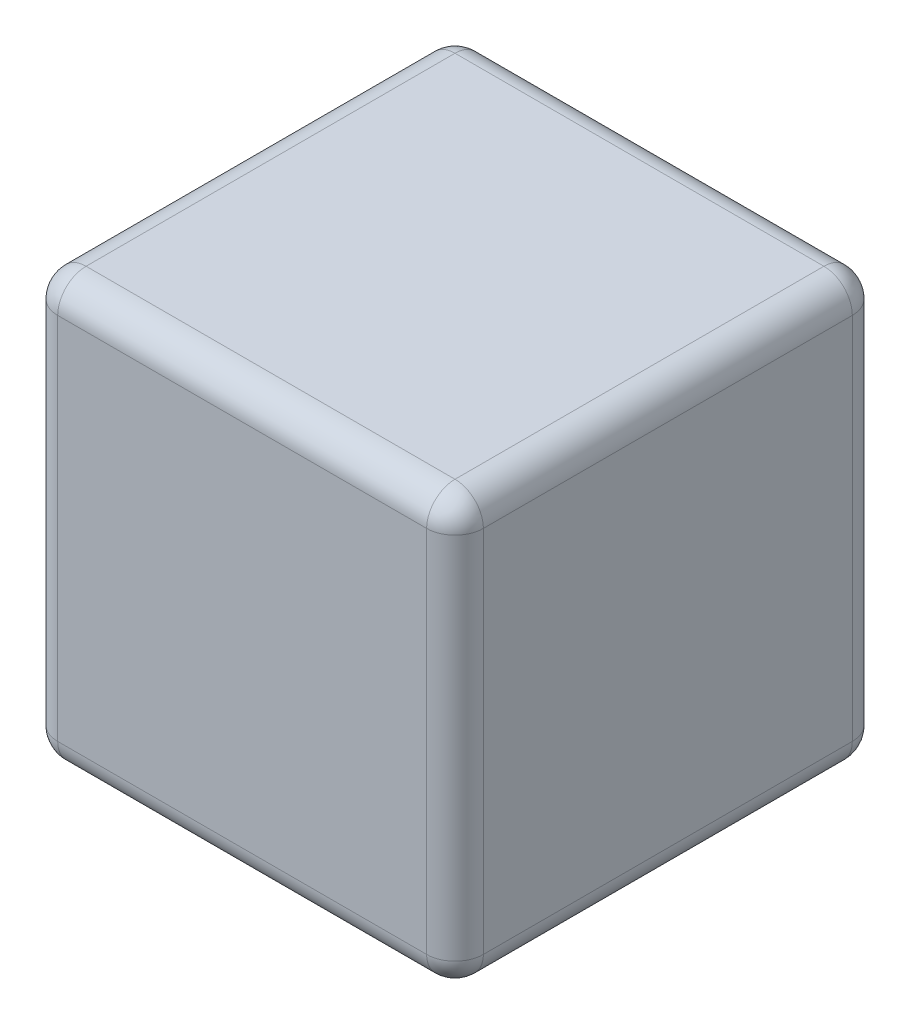
ISO-10303-21;
HEADER;
FILE_DESCRIPTION(('STEP AP214'),'2;1');
FILE_NAME('part.step','',(''),(''),'','','');
FILE_SCHEMA(('AUTOMOTIVE_DESIGN { 1 0 10303 214 1 1 1 1 }'));
ENDSEC;
DATA;
#1=APPLICATION_CONTEXT('core data for automotive mechanical design processes');
#2=APPLICATION_PROTOCOL_DEFINITION('international standard','automotive_design',2000,#1);
#3=PRODUCT_CONTEXT('',#1,'mechanical');
#4=PRODUCT('Part','Part','',(#3));
#5=PRODUCT_RELATED_PRODUCT_CATEGORY('part','',(#4));
#6=PRODUCT_DEFINITION_FORMATION('','',#4);
#7=PRODUCT_DEFINITION_CONTEXT('part definition',#1,'design');
#8=PRODUCT_DEFINITION('design','',#6,#7);
#9=PRODUCT_DEFINITION_SHAPE('','',#8);
#10=(LENGTH_UNIT() NAMED_UNIT(*) SI_UNIT(.MILLI.,.METRE.));
#11=(NAMED_UNIT(*) PLANE_ANGLE_UNIT() SI_UNIT($,.RADIAN.));
#12=(NAMED_UNIT(*) SI_UNIT($,.STERADIAN.) SOLID_ANGLE_UNIT());
#13=UNCERTAINTY_MEASURE_WITH_UNIT(LENGTH_MEASURE(1.E-05),#10,'distance_accuracy_value','');
#14=(GEOMETRIC_REPRESENTATION_CONTEXT(3) GLOBAL_UNCERTAINTY_ASSIGNED_CONTEXT((#13)) GLOBAL_UNIT_ASSIGNED_CONTEXT((#10,
#11,#12)) REPRESENTATION_CONTEXT('',''));
#15=CARTESIAN_POINT('',(0.,0.,0.));
#16=DIRECTION('',(0.,0.,1.));
#17=DIRECTION('',(1.,0.,0.));
#18=AXIS2_PLACEMENT_3D('',#15,#16,#17);
#19=CARTESIAN_POINT('',(19.05,38.1,-19.05));
#20=DIRECTION('',(-1.,0.,0.));
#21=DIRECTION('',(0.,0.,1.));
#22=AXIS2_PLACEMENT_3D('',#19,#20,#21);
#23=PLANE('',#22);
#24=DIRECTION('',(0.,0.,-1.));
#25=VECTOR('',#24,1.);
#26=CARTESIAN_POINT('',(19.05,2.54,-19.05));
#27=LINE('',#26,#25);
#28=CARTESIAN_POINT('',(19.05,2.54,16.51));
#29=VERTEX_POINT('',#28);
#30=CARTESIAN_POINT('',(19.05,2.54,-16.51));
#31=VERTEX_POINT('',#30);
#32=EDGE_CURVE('E185',#29,#31,#27,.T.);
#33=ORIENTED_EDGE('',*,*,#32,.T.);
#34=DIRECTION('',(0.,-1.,0.));
#35=VECTOR('',#34,1.);
#36=CARTESIAN_POINT('',(19.05,38.1,-16.51));
#37=LINE('',#36,#35);
#38=CARTESIAN_POINT('',(19.05,35.56,-16.51));
#39=VERTEX_POINT('',#38);
#40=EDGE_CURVE('E187',#31,#39,#37,.F.);
#41=ORIENTED_EDGE('',*,*,#40,.T.);
#42=DIRECTION('',(0.,0.,-1.));
#43=VECTOR('',#42,1.);
#44=CARTESIAN_POINT('',(19.05,35.56,19.05));
#45=LINE('',#44,#43);
#46=CARTESIAN_POINT('',(19.05,35.56,16.51));
#47=VERTEX_POINT('',#46);
#48=EDGE_CURVE('E183',#39,#47,#45,.F.);
#49=ORIENTED_EDGE('',*,*,#48,.T.);
#50=DIRECTION('',(0.,-1.,0.));
#51=VECTOR('',#50,1.);
#52=CARTESIAN_POINT('',(19.05,38.1,16.51));
#53=LINE('',#52,#51);
#54=EDGE_CURVE('E181',#47,#29,#53,.T.);
#55=ORIENTED_EDGE('',*,*,#54,.T.);
#56=EDGE_LOOP('',(#33,#41,#49,#55));
#57=FACE_BOUND('',#56,.T.);
#58=ADVANCED_FACE('F37',(#57),#23,.F.);
#59=CARTESIAN_POINT('',(-19.05,38.1,-19.05));
#60=DIRECTION('',(0.,0.,1.));
#61=DIRECTION('',(1.,0.,0.));
#62=AXIS2_PLACEMENT_3D('',#59,#60,#61);
#63=PLANE('',#62);
#64=DIRECTION('',(-1.,0.,0.));
#65=VECTOR('',#64,1.);
#66=CARTESIAN_POINT('',(-19.05,2.54,-19.05));
#67=LINE('',#66,#65);
#68=CARTESIAN_POINT('',(16.51,2.54,-19.05));
#69=VERTEX_POINT('',#68);
#70=CARTESIAN_POINT('',(-16.51,2.54,-19.05));
#71=VERTEX_POINT('',#70);
#72=EDGE_CURVE('E176',#69,#71,#67,.T.);
#73=ORIENTED_EDGE('',*,*,#72,.T.);
#74=DIRECTION('',(0.,-1.,0.));
#75=VECTOR('',#74,1.);
#76=CARTESIAN_POINT('',(-16.51,38.1,-19.05));
#77=LINE('',#76,#75);
#78=CARTESIAN_POINT('',(-16.51,35.56,-19.05));
#79=VERTEX_POINT('',#78);
#80=EDGE_CURVE('E178',#71,#79,#77,.F.);
#81=ORIENTED_EDGE('',*,*,#80,.T.);
#82=DIRECTION('',(-1.,0.,0.));
#83=VECTOR('',#82,1.);
#84=CARTESIAN_POINT('',(19.05,35.56,-19.05));
#85=LINE('',#84,#83);
#86=CARTESIAN_POINT('',(16.51,35.56,-19.05));
#87=VERTEX_POINT('',#86);
#88=EDGE_CURVE('E172',#79,#87,#85,.F.);
#89=ORIENTED_EDGE('',*,*,#88,.T.);
#90=DIRECTION('',(0.,-1.,0.));
#91=VECTOR('',#90,1.);
#92=CARTESIAN_POINT('',(16.51,38.1,-19.05));
#93=LINE('',#92,#91);
#94=EDGE_CURVE('E174',#87,#69,#93,.T.);
#95=ORIENTED_EDGE('',*,*,#94,.T.);
#96=EDGE_LOOP('',(#73,#81,#89,#95));
#97=FACE_BOUND('',#96,.T.);
#98=ADVANCED_FACE('F290',(#97),#63,.F.);
#99=CARTESIAN_POINT('',(-19.05,38.1,-19.05));
#100=DIRECTION('',(1.,0.,0.));
#101=DIRECTION('',(0.,0.,-1.));
#102=AXIS2_PLACEMENT_3D('',#99,#100,#101);
#103=PLANE('',#102);
#104=DIRECTION('',(0.,-1.,0.));
#105=VECTOR('',#104,1.);
#106=CARTESIAN_POINT('',(-19.05,38.1,-16.51));
#107=LINE('',#106,#105);
#108=CARTESIAN_POINT('',(-19.05,35.56,-16.51));
#109=VERTEX_POINT('',#108);
#110=CARTESIAN_POINT('',(-19.05,2.54,-16.51));
#111=VERTEX_POINT('',#110);
#112=EDGE_CURVE('E159',#109,#111,#107,.T.);
#113=ORIENTED_EDGE('',*,*,#112,.T.);
#114=DIRECTION('',(0.,0.,1.));
#115=VECTOR('',#114,1.);
#116=CARTESIAN_POINT('',(-19.05,2.54,-19.05));
#117=LINE('',#116,#115);
#118=CARTESIAN_POINT('',(-19.05,2.54,16.51));
#119=VERTEX_POINT('',#118);
#120=EDGE_CURVE('E131',#111,#119,#117,.T.);
#121=ORIENTED_EDGE('',*,*,#120,.T.);
#122=DIRECTION('',(0.,-1.,0.));
#123=VECTOR('',#122,1.);
#124=CARTESIAN_POINT('',(-19.05,38.1,16.51));
#125=LINE('',#124,#123);
#126=CARTESIAN_POINT('',(-19.05,35.56,16.51));
#127=VERTEX_POINT('',#126);
#128=EDGE_CURVE('E149',#119,#127,#125,.F.);
#129=ORIENTED_EDGE('',*,*,#128,.T.);
#130=DIRECTION('',(0.,0.,1.));
#131=VECTOR('',#130,1.);
#132=CARTESIAN_POINT('',(-19.05,35.56,-19.05));
#133=LINE('',#132,#131);
#134=EDGE_CURVE('E155',#127,#109,#133,.F.);
#135=ORIENTED_EDGE('',*,*,#134,.T.);
#136=EDGE_LOOP('',(#113,#121,#129,#135));
#137=FACE_BOUND('',#136,.T.);
#138=ADVANCED_FACE('F157',(#137),#103,.F.);
#139=CARTESIAN_POINT('',(-19.05,38.1,19.05));
#140=DIRECTION('',(0.,0.,-1.));
#141=DIRECTION('',(-1.,0.,0.));
#142=AXIS2_PLACEMENT_3D('',#139,#140,#141);
#143=PLANE('',#142);
#144=DIRECTION('',(1.,0.,0.));
#145=VECTOR('',#144,1.);
#146=CARTESIAN_POINT('',(-19.05,35.56,19.05));
#147=LINE('',#146,#145);
#148=CARTESIAN_POINT('',(16.51,35.56,19.05));
#149=VERTEX_POINT('',#148);
#150=CARTESIAN_POINT('',(-16.51,35.56,19.05));
#151=VERTEX_POINT('',#150);
#152=EDGE_CURVE('E46',#149,#151,#147,.F.);
#153=ORIENTED_EDGE('',*,*,#152,.T.);
#154=DIRECTION('',(0.,-1.,0.));
#155=VECTOR('',#154,1.);
#156=CARTESIAN_POINT('',(-16.51,38.1,19.05));
#157=LINE('',#156,#155);
#158=CARTESIAN_POINT('',(-16.51,2.54,19.05));
#159=VERTEX_POINT('',#158);
#160=EDGE_CURVE('E11',#151,#159,#157,.T.);
#161=ORIENTED_EDGE('',*,*,#160,.T.);
#162=DIRECTION('',(1.,0.,0.));
#163=VECTOR('',#162,1.);
#164=CARTESIAN_POINT('',(-19.05,2.54,19.05));
#165=LINE('',#164,#163);
#166=CARTESIAN_POINT('',(16.51,2.54,19.05));
#167=VERTEX_POINT('',#166);
#168=EDGE_CURVE('E199',#159,#167,#165,.T.);
#169=ORIENTED_EDGE('',*,*,#168,.T.);
#170=DIRECTION('',(0.,-1.,0.));
#171=VECTOR('',#170,1.);
#172=CARTESIAN_POINT('',(16.51,38.1,19.05));
#173=LINE('',#172,#171);
#174=EDGE_CURVE('E57',#167,#149,#173,.F.);
#175=ORIENTED_EDGE('',*,*,#174,.T.);
#176=EDGE_LOOP('',(#153,#161,#169,#175));
#177=FACE_BOUND('',#176,.T.);
#178=ADVANCED_FACE('F330',(#177),#143,.F.);
#179=CARTESIAN_POINT('',(0.,38.1,0.));
#180=DIRECTION('',(0.,1.,0.));
#181=DIRECTION('',(0.,0.,1.));
#182=AXIS2_PLACEMENT_3D('',#179,#180,#181);
#183=PLANE('',#182);
#184=DIRECTION('',(-1.,0.,0.));
#185=VECTOR('',#184,1.);
#186=CARTESIAN_POINT('',(-19.05,38.1,-16.51));
#187=LINE('',#186,#185);
#188=CARTESIAN_POINT('',(16.51,38.1,-16.51));
#189=VERTEX_POINT('',#188);
#190=CARTESIAN_POINT('',(-16.51,38.1,-16.51));
#191=VERTEX_POINT('',#190);
#192=EDGE_CURVE('E194',#189,#191,#187,.T.);
#193=ORIENTED_EDGE('',*,*,#192,.T.);
#194=DIRECTION('',(0.,0.,1.));
#195=VECTOR('',#194,1.);
#196=CARTESIAN_POINT('',(-16.51,38.1,19.05));
#197=LINE('',#196,#195);
#198=CARTESIAN_POINT('',(-16.51,38.1,16.51));
#199=VERTEX_POINT('',#198);
#200=EDGE_CURVE('E196',#191,#199,#197,.T.);
#201=ORIENTED_EDGE('',*,*,#200,.T.);
#202=DIRECTION('',(1.,0.,0.));
#203=VECTOR('',#202,1.);
#204=CARTESIAN_POINT('',(19.05,38.1,16.51));
#205=LINE('',#204,#203);
#206=CARTESIAN_POINT('',(16.51,38.1,16.51));
#207=VERTEX_POINT('',#206);
#208=EDGE_CURVE('E190',#199,#207,#205,.T.);
#209=ORIENTED_EDGE('',*,*,#208,.T.);
#210=DIRECTION('',(0.,0.,-1.));
#211=VECTOR('',#210,1.);
#212=CARTESIAN_POINT('',(16.51,38.1,-19.05));
#213=LINE('',#212,#211);
#214=EDGE_CURVE('E192',#207,#189,#213,.T.);
#215=ORIENTED_EDGE('',*,*,#214,.T.);
#216=EDGE_LOOP('',(#193,#201,#209,#215));
#217=FACE_BOUND('',#216,.T.);
#218=ADVANCED_FACE('F304',(#217),#183,.T.);
#219=CARTESIAN_POINT('',(0.,0.,0.));
#220=DIRECTION('',(0.,1.,0.));
#221=DIRECTION('',(0.,0.,1.));
#222=AXIS2_PLACEMENT_3D('',#219,#220,#221);
#223=PLANE('',#222);
#224=DIRECTION('',(1.,0.,0.));
#225=VECTOR('',#224,1.);
#226=CARTESIAN_POINT('',(0.,0.,16.51));
#227=LINE('',#226,#225);
#228=CARTESIAN_POINT('',(16.51,0.,16.51));
#229=VERTEX_POINT('',#228);
#230=CARTESIAN_POINT('',(-16.51,0.,16.51));
#231=VERTEX_POINT('',#230);
#232=EDGE_CURVE('E161',#229,#231,#227,.F.);
#233=ORIENTED_EDGE('',*,*,#232,.T.);
#234=DIRECTION('',(0.,0.,1.));
#235=VECTOR('',#234,1.);
#236=CARTESIAN_POINT('',(-16.51,0.,0.));
#237=LINE('',#236,#235);
#238=CARTESIAN_POINT('',(-16.51,0.,-16.51));
#239=VERTEX_POINT('',#238);
#240=EDGE_CURVE('E133',#231,#239,#237,.F.);
#241=ORIENTED_EDGE('',*,*,#240,.T.);
#242=DIRECTION('',(-1.,0.,0.));
#243=VECTOR('',#242,1.);
#244=CARTESIAN_POINT('',(0.,0.,-16.51));
#245=LINE('',#244,#243);
#246=CARTESIAN_POINT('',(16.51,0.,-16.51));
#247=VERTEX_POINT('',#246);
#248=EDGE_CURVE('E169',#239,#247,#245,.F.);
#249=ORIENTED_EDGE('',*,*,#248,.T.);
#250=DIRECTION('',(0.,0.,-1.));
#251=VECTOR('',#250,1.);
#252=CARTESIAN_POINT('',(16.51,0.,0.));
#253=LINE('',#252,#251);
#254=EDGE_CURVE('E163',#247,#229,#253,.F.);
#255=ORIENTED_EDGE('',*,*,#254,.T.);
#256=EDGE_LOOP('',(#233,#241,#249,#255));
#257=FACE_BOUND('',#256,.T.);
#258=ADVANCED_FACE('F323',(#257),#223,.F.);
#259=CARTESIAN_POINT('',(16.51,35.56,0.));
#260=DIRECTION('',(0.,0.,1.));
#261=DIRECTION('',(1.,0.,0.));
#262=AXIS2_PLACEMENT_3D('',#259,#260,#261);
#263=CYLINDRICAL_SURFACE('',#262,2.54);
#264=CARTESIAN_POINT('',(16.51,35.56,-16.51));
#265=DIRECTION('',(0.,0.,-1.));
#266=DIRECTION('',(-1.,0.,0.));
#267=AXIS2_PLACEMENT_3D('',#264,#265,#266);
#268=CIRCLE('',#267,2.54);
#269=EDGE_CURVE('E41',#189,#39,#268,.T.);
#270=ORIENTED_EDGE('',*,*,#269,.F.);
#271=ORIENTED_EDGE('',*,*,#214,.F.);
#272=CARTESIAN_POINT('',(16.51,35.56,16.51));
#273=DIRECTION('',(0.,0.,1.));
#274=DIRECTION('',(1.,0.,0.));
#275=AXIS2_PLACEMENT_3D('',#272,#273,#274);
#276=CIRCLE('',#275,2.54);
#277=EDGE_CURVE('E251',#47,#207,#276,.T.);
#278=ORIENTED_EDGE('',*,*,#277,.F.);
#279=ORIENTED_EDGE('',*,*,#48,.F.);
#280=EDGE_LOOP('',(#270,#271,#278,#279));
#281=FACE_BOUND('',#280,.T.);
#282=ADVANCED_FACE('F39',(#281),#263,.T.);
#283=CARTESIAN_POINT('',(16.51,35.56,-16.51));
#284=DIRECTION('',(0.,0.,1.));
#285=DIRECTION('',(1.,0.,0.));
#286=AXIS2_PLACEMENT_3D('',#283,#284,#285);
#287=SPHERICAL_SURFACE('',#286,2.54);
#288=CARTESIAN_POINT('',(16.51,35.56,-16.51));
#289=DIRECTION('',(1.,0.,0.));
#290=DIRECTION('',(0.,0.,-1.));
#291=AXIS2_PLACEMENT_3D('',#288,#289,#290);
#292=CIRCLE('',#291,2.54);
#293=EDGE_CURVE('E247',#189,#87,#292,.F.);
#294=ORIENTED_EDGE('',*,*,#293,.F.);
#295=ORIENTED_EDGE('',*,*,#269,.T.);
#296=CARTESIAN_POINT('',(16.51,35.56,-16.51));
#297=DIRECTION('',(0.,1.,0.));
#298=DIRECTION('',(0.,0.,1.));
#299=AXIS2_PLACEMENT_3D('',#296,#297,#298);
#300=CIRCLE('',#299,2.54);
#301=EDGE_CURVE('E250',#87,#39,#300,.F.);
#302=ORIENTED_EDGE('',*,*,#301,.F.);
#303=EDGE_LOOP('',(#294,#295,#302));
#304=FACE_BOUND('',#303,.T.);
#305=ADVANCED_FACE('F263',(#304),#287,.T.);
#306=CARTESIAN_POINT('',(16.51,35.56,16.51));
#307=DIRECTION('',(0.,0.,1.));
#308=DIRECTION('',(1.,0.,0.));
#309=AXIS2_PLACEMENT_3D('',#306,#307,#308);
#310=SPHERICAL_SURFACE('',#309,2.54);
#311=CARTESIAN_POINT('',(16.51,35.56,16.51));
#312=DIRECTION('',(0.,1.,0.));
#313=DIRECTION('',(0.,0.,1.));
#314=AXIS2_PLACEMENT_3D('',#311,#312,#313);
#315=CIRCLE('',#314,2.54);
#316=EDGE_CURVE('E242',#47,#149,#315,.F.);
#317=ORIENTED_EDGE('',*,*,#316,.F.);
#318=ORIENTED_EDGE('',*,*,#277,.T.);
#319=CARTESIAN_POINT('',(16.51,35.56,16.51));
#320=DIRECTION('',(1.,0.,0.));
#321=DIRECTION('',(0.,0.,-1.));
#322=AXIS2_PLACEMENT_3D('',#319,#320,#321);
#323=CIRCLE('',#322,2.54);
#324=EDGE_CURVE('E244',#149,#207,#323,.F.);
#325=ORIENTED_EDGE('',*,*,#324,.F.);
#326=EDGE_LOOP('',(#317,#318,#325));
#327=FACE_BOUND('',#326,.T.);
#328=ADVANCED_FACE('F312',(#327),#310,.T.);
#329=CARTESIAN_POINT('',(16.51,38.1,-16.51));
#330=DIRECTION('',(0.,-1.,0.));
#331=DIRECTION('',(0.,0.,-1.));
#332=AXIS2_PLACEMENT_3D('',#329,#330,#331);
#333=CYLINDRICAL_SURFACE('',#332,2.54);
#334=ORIENTED_EDGE('',*,*,#301,.T.);
#335=ORIENTED_EDGE('',*,*,#40,.F.);
#336=CARTESIAN_POINT('',(16.51,2.54,-16.51));
#337=DIRECTION('',(0.,-1.,0.));
#338=DIRECTION('',(0.,0.,-1.));
#339=AXIS2_PLACEMENT_3D('',#336,#337,#338);
#340=CIRCLE('',#339,2.54);
#341=EDGE_CURVE('E236',#69,#31,#340,.T.);
#342=ORIENTED_EDGE('',*,*,#341,.F.);
#343=ORIENTED_EDGE('',*,*,#94,.F.);
#344=EDGE_LOOP('',(#334,#335,#342,#343));
#345=FACE_BOUND('',#344,.T.);
#346=ADVANCED_FACE('F274',(#345),#333,.T.);
#347=CARTESIAN_POINT('',(0.,35.56,-16.51));
#348=DIRECTION('',(1.,0.,0.));
#349=DIRECTION('',(0.,0.,-1.));
#350=AXIS2_PLACEMENT_3D('',#347,#348,#349);
#351=CYLINDRICAL_SURFACE('',#350,2.54);
#352=ORIENTED_EDGE('',*,*,#293,.T.);
#353=ORIENTED_EDGE('',*,*,#88,.F.);
#354=CARTESIAN_POINT('',(-16.51,35.56,-16.51));
#355=DIRECTION('',(-1.,0.,0.));
#356=DIRECTION('',(0.,0.,1.));
#357=AXIS2_PLACEMENT_3D('',#354,#355,#356);
#358=CIRCLE('',#357,2.54);
#359=EDGE_CURVE('E233',#191,#79,#358,.T.);
#360=ORIENTED_EDGE('',*,*,#359,.F.);
#361=ORIENTED_EDGE('',*,*,#192,.F.);
#362=EDGE_LOOP('',(#352,#353,#360,#361));
#363=FACE_BOUND('',#362,.T.);
#364=ADVANCED_FACE('F301',(#363),#351,.T.);
#365=CARTESIAN_POINT('',(-16.51,35.56,0.));
#366=DIRECTION('',(0.,0.,-1.));
#367=DIRECTION('',(-1.,0.,0.));
#368=AXIS2_PLACEMENT_3D('',#365,#366,#367);
#369=CYLINDRICAL_SURFACE('',#368,2.54);
#370=CARTESIAN_POINT('',(-16.51,35.56,16.51));
#371=DIRECTION('',(0.,0.,1.));
#372=DIRECTION('',(1.,0.,0.));
#373=AXIS2_PLACEMENT_3D('',#370,#371,#372);
#374=CIRCLE('',#373,2.54);
#375=EDGE_CURVE('E227',#199,#127,#374,.T.);
#376=ORIENTED_EDGE('',*,*,#375,.F.);
#377=ORIENTED_EDGE('',*,*,#200,.F.);
#378=CARTESIAN_POINT('',(-16.51,35.56,-16.51));
#379=DIRECTION('',(0.,0.,-1.));
#380=DIRECTION('',(-1.,0.,0.));
#381=AXIS2_PLACEMENT_3D('',#378,#379,#380);
#382=CIRCLE('',#381,2.54);
#383=EDGE_CURVE('E230',#109,#191,#382,.T.);
#384=ORIENTED_EDGE('',*,*,#383,.F.);
#385=ORIENTED_EDGE('',*,*,#134,.F.);
#386=EDGE_LOOP('',(#376,#377,#384,#385));
#387=FACE_BOUND('',#386,.T.);
#388=ADVANCED_FACE('F307',(#387),#369,.T.);
#389=CARTESIAN_POINT('',(0.,35.56,16.51));
#390=DIRECTION('',(-1.,0.,0.));
#391=DIRECTION('',(0.,0.,1.));
#392=AXIS2_PLACEMENT_3D('',#389,#390,#391);
#393=CYLINDRICAL_SURFACE('',#392,2.54);
#394=ORIENTED_EDGE('',*,*,#324,.T.);
#395=ORIENTED_EDGE('',*,*,#208,.F.);
#396=CARTESIAN_POINT('',(-16.51,35.56,16.51));
#397=DIRECTION('',(-1.,0.,0.));
#398=DIRECTION('',(0.,0.,1.));
#399=AXIS2_PLACEMENT_3D('',#396,#397,#398);
#400=CIRCLE('',#399,2.54);
#401=EDGE_CURVE('E225',#151,#199,#400,.T.);
#402=ORIENTED_EDGE('',*,*,#401,.F.);
#403=ORIENTED_EDGE('',*,*,#152,.F.);
#404=EDGE_LOOP('',(#394,#395,#402,#403));
#405=FACE_BOUND('',#404,.T.);
#406=ADVANCED_FACE('F311',(#405),#393,.T.);
#407=CARTESIAN_POINT('',(16.51,38.1,16.51));
#408=DIRECTION('',(0.,-1.,0.));
#409=DIRECTION('',(0.,0.,-1.));
#410=AXIS2_PLACEMENT_3D('',#407,#408,#409);
#411=CYLINDRICAL_SURFACE('',#410,2.54);
#412=ORIENTED_EDGE('',*,*,#316,.T.);
#413=ORIENTED_EDGE('',*,*,#174,.F.);
#414=CARTESIAN_POINT('',(16.51,2.54,16.51));
#415=DIRECTION('',(0.,-1.,0.));
#416=DIRECTION('',(0.,0.,-1.));
#417=AXIS2_PLACEMENT_3D('',#414,#415,#416);
#418=CIRCLE('',#417,2.54);
#419=EDGE_CURVE('E222',#29,#167,#418,.T.);
#420=ORIENTED_EDGE('',*,*,#419,.F.);
#421=ORIENTED_EDGE('',*,*,#54,.F.);
#422=EDGE_LOOP('',(#412,#413,#420,#421));
#423=FACE_BOUND('',#422,.T.);
#424=ADVANCED_FACE('F315',(#423),#411,.T.);
#425=CARTESIAN_POINT('',(16.51,2.54,-19.05));
#426=DIRECTION('',(0.,0.,-1.));
#427=DIRECTION('',(-1.,0.,0.));
#428=AXIS2_PLACEMENT_3D('',#425,#426,#427);
#429=CYLINDRICAL_SURFACE('',#428,2.54);
#430=CARTESIAN_POINT('',(16.51,2.54,-16.51));
#431=DIRECTION('',(0.,0.,-1.));
#432=DIRECTION('',(-1.,0.,0.));
#433=AXIS2_PLACEMENT_3D('',#430,#431,#432);
#434=CIRCLE('',#433,2.54);
#435=EDGE_CURVE('E239',#31,#247,#434,.T.);
#436=ORIENTED_EDGE('',*,*,#435,.F.);
#437=ORIENTED_EDGE('',*,*,#32,.F.);
#438=CARTESIAN_POINT('',(16.51,2.54,16.51));
#439=DIRECTION('',(0.,0.,1.));
#440=DIRECTION('',(1.,0.,0.));
#441=AXIS2_PLACEMENT_3D('',#438,#439,#440);
#442=CIRCLE('',#441,2.54);
#443=EDGE_CURVE('E219',#229,#29,#442,.T.);
#444=ORIENTED_EDGE('',*,*,#443,.F.);
#445=ORIENTED_EDGE('',*,*,#254,.F.);
#446=EDGE_LOOP('',(#436,#437,#444,#445));
#447=FACE_BOUND('',#446,.T.);
#448=ADVANCED_FACE('F278',(#447),#429,.T.);
#449=CARTESIAN_POINT('',(16.51,2.54,-16.51));
#450=DIRECTION('',(0.,0.,1.));
#451=DIRECTION('',(1.,0.,0.));
#452=AXIS2_PLACEMENT_3D('',#449,#450,#451);
#453=SPHERICAL_SURFACE('',#452,2.54);
#454=ORIENTED_EDGE('',*,*,#341,.T.);
#455=ORIENTED_EDGE('',*,*,#435,.T.);
#456=CARTESIAN_POINT('',(16.51,2.54,-16.51));
#457=DIRECTION('',(1.,0.,0.));
#458=DIRECTION('',(0.,0.,-1.));
#459=AXIS2_PLACEMENT_3D('',#456,#457,#458);
#460=CIRCLE('',#459,2.54);
#461=EDGE_CURVE('E216',#69,#247,#460,.F.);
#462=ORIENTED_EDGE('',*,*,#461,.F.);
#463=EDGE_LOOP('',(#454,#455,#462));
#464=FACE_BOUND('',#463,.T.);
#465=ADVANCED_FACE('F282',(#464),#453,.T.);
#466=CARTESIAN_POINT('',(-16.51,35.56,-16.51));
#467=DIRECTION('',(0.,0.,1.));
#468=DIRECTION('',(1.,0.,0.));
#469=AXIS2_PLACEMENT_3D('',#466,#467,#468);
#470=SPHERICAL_SURFACE('',#469,2.54);
#471=ORIENTED_EDGE('',*,*,#383,.T.);
#472=ORIENTED_EDGE('',*,*,#359,.T.);
#473=CARTESIAN_POINT('',(-16.51,35.56,-16.51));
#474=DIRECTION('',(0.,1.,0.));
#475=DIRECTION('',(0.,0.,1.));
#476=AXIS2_PLACEMENT_3D('',#473,#474,#475);
#477=CIRCLE('',#476,2.54);
#478=EDGE_CURVE('E214',#109,#79,#477,.F.);
#479=ORIENTED_EDGE('',*,*,#478,.F.);
#480=EDGE_LOOP('',(#471,#472,#479));
#481=FACE_BOUND('',#480,.T.);
#482=ADVANCED_FACE('F298',(#481),#470,.T.);
#483=CARTESIAN_POINT('',(-16.51,35.56,16.51));
#484=DIRECTION('',(0.,0.,1.));
#485=DIRECTION('',(1.,0.,0.));
#486=AXIS2_PLACEMENT_3D('',#483,#484,#485);
#487=SPHERICAL_SURFACE('',#486,2.54);
#488=ORIENTED_EDGE('',*,*,#401,.T.);
#489=ORIENTED_EDGE('',*,*,#375,.T.);
#490=CARTESIAN_POINT('',(-16.51,35.56,16.51));
#491=DIRECTION('',(0.,1.,0.));
#492=DIRECTION('',(0.,0.,1.));
#493=AXIS2_PLACEMENT_3D('',#490,#491,#492);
#494=CIRCLE('',#493,2.54);
#495=EDGE_CURVE('E152',#151,#127,#494,.F.);
#496=ORIENTED_EDGE('',*,*,#495,.F.);
#497=EDGE_LOOP('',(#488,#489,#496));
#498=FACE_BOUND('',#497,.T.);
#499=ADVANCED_FACE('F359',(#498),#487,.T.);
#500=CARTESIAN_POINT('',(16.51,2.54,16.51));
#501=DIRECTION('',(0.,0.,1.));
#502=DIRECTION('',(1.,0.,0.));
#503=AXIS2_PLACEMENT_3D('',#500,#501,#502);
#504=SPHERICAL_SURFACE('',#503,2.54);
#505=ORIENTED_EDGE('',*,*,#443,.T.);
#506=ORIENTED_EDGE('',*,*,#419,.T.);
#507=CARTESIAN_POINT('',(16.51,2.54,16.51));
#508=DIRECTION('',(1.,0.,0.));
#509=DIRECTION('',(0.,0.,-1.));
#510=AXIS2_PLACEMENT_3D('',#507,#508,#509);
#511=CIRCLE('',#510,2.54);
#512=EDGE_CURVE('E210',#229,#167,#511,.F.);
#513=ORIENTED_EDGE('',*,*,#512,.F.);
#514=EDGE_LOOP('',(#505,#506,#513));
#515=FACE_BOUND('',#514,.T.);
#516=ADVANCED_FACE('F318',(#515),#504,.T.);
#517=CARTESIAN_POINT('',(-19.05,2.54,-16.51));
#518=DIRECTION('',(-1.,0.,0.));
#519=DIRECTION('',(0.,0.,1.));
#520=AXIS2_PLACEMENT_3D('',#517,#518,#519);
#521=CYLINDRICAL_SURFACE('',#520,2.54);
#522=ORIENTED_EDGE('',*,*,#461,.T.);
#523=ORIENTED_EDGE('',*,*,#248,.F.);
#524=CARTESIAN_POINT('',(-16.51,2.54,-16.51));
#525=DIRECTION('',(-1.,0.,0.));
#526=DIRECTION('',(0.,0.,1.));
#527=AXIS2_PLACEMENT_3D('',#524,#525,#526);
#528=CIRCLE('',#527,2.54);
#529=EDGE_CURVE('E207',#71,#239,#528,.T.);
#530=ORIENTED_EDGE('',*,*,#529,.F.);
#531=ORIENTED_EDGE('',*,*,#72,.F.);
#532=EDGE_LOOP('',(#522,#523,#530,#531));
#533=FACE_BOUND('',#532,.T.);
#534=ADVANCED_FACE('F287',(#533),#521,.T.);
#535=CARTESIAN_POINT('',(-16.51,38.1,-16.51));
#536=DIRECTION('',(0.,-1.,0.));
#537=DIRECTION('',(0.,0.,-1.));
#538=AXIS2_PLACEMENT_3D('',#535,#536,#537);
#539=CYLINDRICAL_SURFACE('',#538,2.54);
#540=ORIENTED_EDGE('',*,*,#478,.T.);
#541=ORIENTED_EDGE('',*,*,#80,.F.);
#542=CARTESIAN_POINT('',(-16.51,2.54,-16.51));
#543=DIRECTION('',(0.,-1.,0.));
#544=DIRECTION('',(0.,0.,-1.));
#545=AXIS2_PLACEMENT_3D('',#542,#543,#544);
#546=CIRCLE('',#545,2.54);
#547=EDGE_CURVE('E146',#111,#71,#546,.T.);
#548=ORIENTED_EDGE('',*,*,#547,.F.);
#549=ORIENTED_EDGE('',*,*,#112,.F.);
#550=EDGE_LOOP('',(#540,#541,#548,#549));
#551=FACE_BOUND('',#550,.T.);
#552=ADVANCED_FACE('F292',(#551),#539,.T.);
#553=CARTESIAN_POINT('',(-16.51,38.1,16.51));
#554=DIRECTION('',(0.,-1.,0.));
#555=DIRECTION('',(0.,0.,-1.));
#556=AXIS2_PLACEMENT_3D('',#553,#554,#555);
#557=CYLINDRICAL_SURFACE('',#556,2.54);
#558=ORIENTED_EDGE('',*,*,#495,.T.);
#559=ORIENTED_EDGE('',*,*,#128,.F.);
#560=CARTESIAN_POINT('',(-16.51,2.54,16.51));
#561=DIRECTION('',(0.,-1.,0.));
#562=DIRECTION('',(0.,0.,-1.));
#563=AXIS2_PLACEMENT_3D('',#560,#561,#562);
#564=CIRCLE('',#563,2.54);
#565=EDGE_CURVE('E138',#159,#119,#564,.T.);
#566=ORIENTED_EDGE('',*,*,#565,.F.);
#567=ORIENTED_EDGE('',*,*,#160,.F.);
#568=EDGE_LOOP('',(#558,#559,#566,#567));
#569=FACE_BOUND('',#568,.T.);
#570=ADVANCED_FACE('F150',(#569),#557,.T.);
#571=CARTESIAN_POINT('',(-19.05,2.54,16.51));
#572=DIRECTION('',(1.,0.,0.));
#573=DIRECTION('',(0.,0.,-1.));
#574=AXIS2_PLACEMENT_3D('',#571,#572,#573);
#575=CYLINDRICAL_SURFACE('',#574,2.54);
#576=ORIENTED_EDGE('',*,*,#512,.T.);
#577=ORIENTED_EDGE('',*,*,#168,.F.);
#578=CARTESIAN_POINT('',(-16.51,2.54,16.51));
#579=DIRECTION('',(-1.,0.,0.));
#580=DIRECTION('',(0.,0.,1.));
#581=AXIS2_PLACEMENT_3D('',#578,#579,#580);
#582=CIRCLE('',#581,2.54);
#583=EDGE_CURVE('E142',#231,#159,#582,.T.);
#584=ORIENTED_EDGE('',*,*,#583,.F.);
#585=ORIENTED_EDGE('',*,*,#232,.F.);
#586=EDGE_LOOP('',(#576,#577,#584,#585));
#587=FACE_BOUND('',#586,.T.);
#588=ADVANCED_FACE('F321',(#587),#575,.T.);
#589=CARTESIAN_POINT('',(-16.51,2.54,-16.51));
#590=DIRECTION('',(0.,0.,1.));
#591=DIRECTION('',(1.,0.,0.));
#592=AXIS2_PLACEMENT_3D('',#589,#590,#591);
#593=SPHERICAL_SURFACE('',#592,2.54);
#594=ORIENTED_EDGE('',*,*,#547,.T.);
#595=ORIENTED_EDGE('',*,*,#529,.T.);
#596=CARTESIAN_POINT('',(-16.51,2.54,-16.51));
#597=DIRECTION('',(0.,0.,-1.));
#598=DIRECTION('',(-1.,0.,0.));
#599=AXIS2_PLACEMENT_3D('',#596,#597,#598);
#600=CIRCLE('',#599,2.54);
#601=EDGE_CURVE('E135',#111,#239,#600,.F.);
#602=ORIENTED_EDGE('',*,*,#601,.F.);
#603=EDGE_LOOP('',(#594,#595,#602));
#604=FACE_BOUND('',#603,.T.);
#605=ADVANCED_FACE('F345',(#604),#593,.T.);
#606=CARTESIAN_POINT('',(-16.51,2.54,16.51));
#607=DIRECTION('',(0.,0.,1.));
#608=DIRECTION('',(1.,0.,0.));
#609=AXIS2_PLACEMENT_3D('',#606,#607,#608);
#610=SPHERICAL_SURFACE('',#609,2.54);
#611=ORIENTED_EDGE('',*,*,#583,.T.);
#612=ORIENTED_EDGE('',*,*,#565,.T.);
#613=CARTESIAN_POINT('',(-16.51,2.54,16.51));
#614=DIRECTION('',(0.,0.,1.));
#615=DIRECTION('',(1.,0.,0.));
#616=AXIS2_PLACEMENT_3D('',#613,#614,#615);
#617=CIRCLE('',#616,2.54);
#618=EDGE_CURVE('E127',#231,#119,#617,.F.);
#619=ORIENTED_EDGE('',*,*,#618,.F.);
#620=EDGE_LOOP('',(#611,#612,#619));
#621=FACE_BOUND('',#620,.T.);
#622=ADVANCED_FACE('F140',(#621),#610,.T.);
#623=CARTESIAN_POINT('',(-16.51,2.54,-19.05));
#624=DIRECTION('',(0.,0.,1.));
#625=DIRECTION('',(1.,0.,0.));
#626=AXIS2_PLACEMENT_3D('',#623,#624,#625);
#627=CYLINDRICAL_SURFACE('',#626,2.54);
#628=ORIENTED_EDGE('',*,*,#601,.T.);
#629=ORIENTED_EDGE('',*,*,#240,.F.);
#630=ORIENTED_EDGE('',*,*,#618,.T.);
#631=ORIENTED_EDGE('',*,*,#120,.F.);
#632=EDGE_LOOP('',(#628,#629,#630,#631));
#633=FACE_BOUND('',#632,.T.);
#634=ADVANCED_FACE('F129',(#633),#627,.T.);
#635=CLOSED_SHELL('',(#58,#98,#138,#178,#218,#258,#282,#305,#328,#346,#364,#388,#406,#424,#448,
#465,#482,#499,#516,#534,#552,#570,#588,#605,#622,#634));
#636=MANIFOLD_SOLID_BREP('B2',#635);
#637=ADVANCED_BREP_SHAPE_REPRESENTATION('',(#18,#636),#14);
#638=SHAPE_DEFINITION_REPRESENTATION(#9,#637);
ENDSEC;
END-ISO-10303-21;
